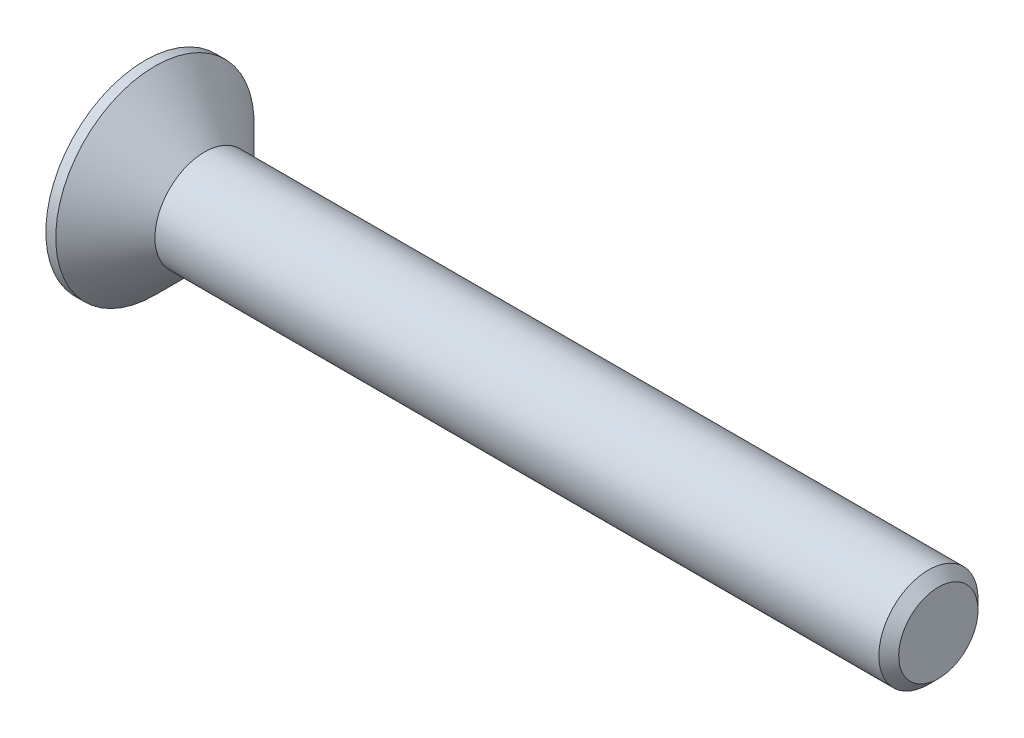
ISO-10303-21;
HEADER;
FILE_DESCRIPTION(('STEP AP214'),'2;1');
FILE_NAME('part.step','',(''),(''),'','','');
FILE_SCHEMA(('AUTOMOTIVE_DESIGN { 1 0 10303 214 1 1 1 1 }'));
ENDSEC;
DATA;
#1=APPLICATION_CONTEXT('core data for automotive mechanical design processes');
#2=APPLICATION_PROTOCOL_DEFINITION('international standard','automotive_design',2000,#1);
#3=PRODUCT_CONTEXT('',#1,'mechanical');
#4=PRODUCT('Part','Part','',(#3));
#5=PRODUCT_RELATED_PRODUCT_CATEGORY('part','',(#4));
#6=PRODUCT_DEFINITION_FORMATION('','',#4);
#7=PRODUCT_DEFINITION_CONTEXT('part definition',#1,'design');
#8=PRODUCT_DEFINITION('design','',#6,#7);
#9=PRODUCT_DEFINITION_SHAPE('','',#8);
#10=(LENGTH_UNIT() NAMED_UNIT(*) SI_UNIT(.MILLI.,.METRE.));
#11=(NAMED_UNIT(*) PLANE_ANGLE_UNIT() SI_UNIT($,.RADIAN.));
#12=(NAMED_UNIT(*) SI_UNIT($,.STERADIAN.) SOLID_ANGLE_UNIT());
#13=UNCERTAINTY_MEASURE_WITH_UNIT(LENGTH_MEASURE(1.E-05),#10,'distance_accuracy_value','');
#14=(GEOMETRIC_REPRESENTATION_CONTEXT(3) GLOBAL_UNCERTAINTY_ASSIGNED_CONTEXT((#13)) GLOBAL_UNIT_ASSIGNED_CONTEXT((#10,
#11,#12)) REPRESENTATION_CONTEXT('',''));
#15=CARTESIAN_POINT('',(0.,0.,0.));
#16=DIRECTION('',(0.,0.,1.));
#17=DIRECTION('',(1.,0.,0.));
#18=AXIS2_PLACEMENT_3D('',#15,#16,#17);
#19=CARTESIAN_POINT('',(-1.2,0.,0.));
#20=DIRECTION('',(-1.,0.,0.));
#21=DIRECTION('',(0.,-1.,0.));
#22=AXIS2_PLACEMENT_3D('',#19,#20,#21);
#23=CYLINDRICAL_SURFACE('',#22,1.);
#24=CARTESIAN_POINT('',(14.6,0.,0.));
#25=DIRECTION('',(-1.,0.,0.));
#26=DIRECTION('',(0.,-1.,0.));
#27=AXIS2_PLACEMENT_3D('',#24,#25,#26);
#28=CIRCLE('',#27,1.);
#29=CARTESIAN_POINT('',(14.6,-1.,0.));
#30=VERTEX_POINT('',#29);
#31=EDGE_CURVE('E43',#30,#30,#28,.T.);
#32=ORIENTED_EDGE('',*,*,#31,.T.);
#33=EDGE_LOOP('',(#32));
#34=FACE_BOUND('',#33,.T.);
#35=CARTESIAN_POINT('',(0.,0.,0.));
#36=DIRECTION('',(-1.,0.,0.));
#37=DIRECTION('',(0.,-1.,0.));
#38=AXIS2_PLACEMENT_3D('',#35,#36,#37);
#39=CIRCLE('',#38,1.);
#40=CARTESIAN_POINT('',(0.,-1.,0.));
#41=VERTEX_POINT('',#40);
#42=EDGE_CURVE('E148',#41,#41,#39,.T.);
#43=ORIENTED_EDGE('',*,*,#42,.F.);
#44=EDGE_LOOP('',(#43));
#45=FACE_BOUND('',#44,.T.);
#46=ADVANCED_FACE('F35',(#34,#45),#23,.T.);
#47=CARTESIAN_POINT('',(0.,0.,0.));
#48=DIRECTION('',(-1.,0.,0.));
#49=DIRECTION('',(0.,-1.,0.));
#50=AXIS2_PLACEMENT_3D('',#47,#48,#49);
#51=CONICAL_SURFACE('',#50,1.,0.785398163397444);
#52=CARTESIAN_POINT('',(-1.00000000000001,0.,0.));
#53=DIRECTION('',(-1.,0.,0.));
#54=DIRECTION('',(0.,-1.,0.));
#55=AXIS2_PLACEMENT_3D('',#52,#53,#54);
#56=CIRCLE('',#55,2.);
#57=CARTESIAN_POINT('',(-1.00000000000001,-2.,0.));
#58=VERTEX_POINT('',#57);
#59=EDGE_CURVE('E145',#58,#58,#56,.T.);
#60=ORIENTED_EDGE('',*,*,#59,.F.);
#61=EDGE_LOOP('',(#60));
#62=FACE_BOUND('',#61,.T.);
#63=ORIENTED_EDGE('',*,*,#42,.T.);
#64=EDGE_LOOP('',(#63));
#65=FACE_BOUND('',#64,.T.);
#66=ADVANCED_FACE('F170',(#62,#65),#51,.T.);
#67=CARTESIAN_POINT('',(-1.2,0.,0.));
#68=DIRECTION('',(-1.,0.,0.));
#69=DIRECTION('',(0.,-1.,0.));
#70=AXIS2_PLACEMENT_3D('',#67,#68,#69);
#71=CYLINDRICAL_SURFACE('',#70,2.);
#72=CARTESIAN_POINT('',(-1.2,0.,0.));
#73=DIRECTION('',(-1.,0.,0.));
#74=DIRECTION('',(0.,-1.,0.));
#75=AXIS2_PLACEMENT_3D('',#72,#73,#74);
#76=CIRCLE('',#75,2.);
#77=CARTESIAN_POINT('',(-1.2,-2.,0.));
#78=VERTEX_POINT('',#77);
#79=EDGE_CURVE('E137',#78,#78,#76,.T.);
#80=ORIENTED_EDGE('',*,*,#79,.F.);
#81=EDGE_LOOP('',(#80));
#82=FACE_BOUND('',#81,.T.);
#83=ORIENTED_EDGE('',*,*,#59,.T.);
#84=EDGE_LOOP('',(#83));
#85=FACE_BOUND('',#84,.T.);
#86=ADVANCED_FACE('F174',(#82,#85),#71,.T.);
#87=CARTESIAN_POINT('',(-1.2,2.,0.));
#88=DIRECTION('',(1.,0.,0.));
#89=DIRECTION('',(0.,1.,0.));
#90=AXIS2_PLACEMENT_3D('',#87,#88,#89);
#91=PLANE('',#90);
#92=DIRECTION('',(0.,-0.866025403784439,0.5));
#93=VECTOR('',#92,1.);
#94=CARTESIAN_POINT('',(-1.2,0.,-0.750555349946514));
#95=LINE('',#94,#93);
#96=CARTESIAN_POINT('',(-1.2,0.,-0.750555349946513));
#97=VERTEX_POINT('',#96);
#98=CARTESIAN_POINT('',(-1.2,-0.65,-0.375277674973257));
#99=VERTEX_POINT('',#98);
#100=EDGE_CURVE('E124',#97,#99,#95,.T.);
#101=ORIENTED_EDGE('',*,*,#100,.F.);
#102=DIRECTION('',(0.,-0.866025403784438,-0.5));
#103=VECTOR('',#102,1.);
#104=CARTESIAN_POINT('',(-1.2,0.65,-0.375277674973257));
#105=LINE('',#104,#103);
#106=CARTESIAN_POINT('',(-1.2,0.65,-0.375277674973257));
#107=VERTEX_POINT('',#106);
#108=EDGE_CURVE('E50',#107,#97,#105,.T.);
#109=ORIENTED_EDGE('',*,*,#108,.F.);
#110=DIRECTION('',(0.,0.,-1.));
#111=VECTOR('',#110,1.);
#112=CARTESIAN_POINT('',(-1.2,0.65,0.375277674973257));
#113=LINE('',#112,#111);
#114=CARTESIAN_POINT('',(-1.2,0.65,0.375277674973257));
#115=VERTEX_POINT('',#114);
#116=EDGE_CURVE('E133',#115,#107,#113,.T.);
#117=ORIENTED_EDGE('',*,*,#116,.F.);
#118=DIRECTION('',(0.,0.866025403784439,-0.5));
#119=VECTOR('',#118,1.);
#120=CARTESIAN_POINT('',(-1.2,0.,0.750555349946513));
#121=LINE('',#120,#119);
#122=CARTESIAN_POINT('',(-1.2,0.,0.750555349946513));
#123=VERTEX_POINT('',#122);
#124=EDGE_CURVE('E131',#123,#115,#121,.T.);
#125=ORIENTED_EDGE('',*,*,#124,.F.);
#126=DIRECTION('',(0.,0.866025403784439,0.5));
#127=VECTOR('',#126,1.);
#128=CARTESIAN_POINT('',(-1.2,-0.65,0.375277674973257));
#129=LINE('',#128,#127);
#130=CARTESIAN_POINT('',(-1.2,-0.65,0.375277674973257));
#131=VERTEX_POINT('',#130);
#132=EDGE_CURVE('E98',#131,#123,#129,.T.);
#133=ORIENTED_EDGE('',*,*,#132,.F.);
#134=DIRECTION('',(0.,0.,1.));
#135=VECTOR('',#134,1.);
#136=CARTESIAN_POINT('',(-1.2,-0.65,-0.375277674973257));
#137=LINE('',#136,#135);
#138=EDGE_CURVE('E127',#99,#131,#137,.T.);
#139=ORIENTED_EDGE('',*,*,#138,.F.);
#140=EDGE_LOOP('',(#101,#109,#117,#125,#133,#139));
#141=FACE_BOUND('',#140,.T.);
#142=ORIENTED_EDGE('',*,*,#79,.T.);
#143=EDGE_LOOP('',(#142));
#144=FACE_BOUND('',#143,.T.);
#145=ADVANCED_FACE('F165',(#141,#144),#91,.F.);
#146=CARTESIAN_POINT('',(14.8,0.,0.));
#147=DIRECTION('',(-1.,0.,0.));
#148=DIRECTION('',(0.,-1.,0.));
#149=AXIS2_PLACEMENT_3D('',#146,#147,#148);
#150=PLANE('',#149);
#151=CARTESIAN_POINT('',(14.8,0.,0.));
#152=DIRECTION('',(-1.,0.,0.));
#153=DIRECTION('',(0.,-1.,0.));
#154=AXIS2_PLACEMENT_3D('',#151,#152,#153);
#155=CIRCLE('',#154,0.8);
#156=CARTESIAN_POINT('',(14.8,-0.8,0.));
#157=VERTEX_POINT('',#156);
#158=EDGE_CURVE('E11',#157,#157,#155,.F.);
#159=ORIENTED_EDGE('',*,*,#158,.T.);
#160=EDGE_LOOP('',(#159));
#161=FACE_BOUND('',#160,.T.);
#162=ADVANCED_FACE('F157',(#161),#150,.F.);
#163=CARTESIAN_POINT('',(14.6,0.,0.));
#164=DIRECTION('',(-1.,0.,0.));
#165=DIRECTION('',(0.,-1.,0.));
#166=AXIS2_PLACEMENT_3D('',#163,#164,#165);
#167=CONICAL_SURFACE('',#166,1.,0.785398163397442);
#168=ORIENTED_EDGE('',*,*,#158,.F.);
#169=EDGE_LOOP('',(#168));
#170=FACE_BOUND('',#169,.T.);
#171=ORIENTED_EDGE('',*,*,#31,.F.);
#172=EDGE_LOOP('',(#171));
#173=FACE_BOUND('',#172,.T.);
#174=ADVANCED_FACE('F37',(#170,#173),#167,.T.);
#175=CARTESIAN_POINT('',(-0.45,0.65,-0.375277674973257));
#176=DIRECTION('',(0.,0.5,-0.866025403784439));
#177=DIRECTION('',(0.,0.866025403784439,0.5));
#178=AXIS2_PLACEMENT_3D('',#175,#176,#177);
#179=PLANE('',#178);
#180=ORIENTED_EDGE('',*,*,#108,.T.);
#181=DIRECTION('',(-1.,0.,0.));
#182=VECTOR('',#181,1.);
#183=CARTESIAN_POINT('',(-0.45,0.,-0.750555349946514));
#184=LINE('',#183,#182);
#185=CARTESIAN_POINT('',(-0.45,0.,-0.750555349946514));
#186=VERTEX_POINT('',#185);
#187=EDGE_CURVE('E80',#186,#97,#184,.T.);
#188=ORIENTED_EDGE('',*,*,#187,.F.);
#189=DIRECTION('',(0.,-0.866025403784438,-0.5));
#190=VECTOR('',#189,1.);
#191=CARTESIAN_POINT('',(-0.45,0.65,-0.375277674973257));
#192=LINE('',#191,#190);
#193=CARTESIAN_POINT('',(-0.45,0.65,-0.375277674973257));
#194=VERTEX_POINT('',#193);
#195=EDGE_CURVE('E135',#194,#186,#192,.T.);
#196=ORIENTED_EDGE('',*,*,#195,.F.);
#197=DIRECTION('',(-1.,0.,0.));
#198=VECTOR('',#197,1.);
#199=CARTESIAN_POINT('',(-0.45,0.65,-0.375277674973257));
#200=LINE('',#199,#198);
#201=EDGE_CURVE('E58',#194,#107,#200,.T.);
#202=ORIENTED_EDGE('',*,*,#201,.T.);
#203=EDGE_LOOP('',(#180,#188,#196,#202));
#204=FACE_BOUND('',#203,.T.);
#205=ADVANCED_FACE('F156',(#204),#179,.F.);
#206=CARTESIAN_POINT('',(-0.45,0.65,0.375277674973257));
#207=DIRECTION('',(0.,1.,0.));
#208=DIRECTION('',(0.,0.,1.));
#209=AXIS2_PLACEMENT_3D('',#206,#207,#208);
#210=PLANE('',#209);
#211=ORIENTED_EDGE('',*,*,#116,.T.);
#212=ORIENTED_EDGE('',*,*,#201,.F.);
#213=DIRECTION('',(0.,0.,-1.));
#214=VECTOR('',#213,1.);
#215=CARTESIAN_POINT('',(-0.45,0.65,0.375277674973257));
#216=LINE('',#215,#214);
#217=CARTESIAN_POINT('',(-0.45,0.65,0.375277674973257));
#218=VERTEX_POINT('',#217);
#219=EDGE_CURVE('E110',#218,#194,#216,.T.);
#220=ORIENTED_EDGE('',*,*,#219,.F.);
#221=DIRECTION('',(-1.,0.,0.));
#222=VECTOR('',#221,1.);
#223=CARTESIAN_POINT('',(-0.45,0.65,0.375277674973257));
#224=LINE('',#223,#222);
#225=EDGE_CURVE('E102',#218,#115,#224,.T.);
#226=ORIENTED_EDGE('',*,*,#225,.T.);
#227=EDGE_LOOP('',(#211,#212,#220,#226));
#228=FACE_BOUND('',#227,.T.);
#229=ADVANCED_FACE('F163',(#228),#210,.F.);
#230=CARTESIAN_POINT('',(-0.45,0.,0.750555349946513));
#231=DIRECTION('',(0.,0.5,0.866025403784439));
#232=DIRECTION('',(0.,-0.866025403784439,0.5));
#233=AXIS2_PLACEMENT_3D('',#230,#231,#232);
#234=PLANE('',#233);
#235=ORIENTED_EDGE('',*,*,#124,.T.);
#236=ORIENTED_EDGE('',*,*,#225,.F.);
#237=DIRECTION('',(0.,0.866025403784439,-0.5));
#238=VECTOR('',#237,1.);
#239=CARTESIAN_POINT('',(-0.45,0.,0.750555349946513));
#240=LINE('',#239,#238);
#241=CARTESIAN_POINT('',(-0.45,0.,0.750555349946513));
#242=VERTEX_POINT('',#241);
#243=EDGE_CURVE('E106',#242,#218,#240,.T.);
#244=ORIENTED_EDGE('',*,*,#243,.F.);
#245=DIRECTION('',(-1.,0.,0.));
#246=VECTOR('',#245,1.);
#247=CARTESIAN_POINT('',(-0.45,0.,0.750555349946513));
#248=LINE('',#247,#246);
#249=EDGE_CURVE('E91',#242,#123,#248,.T.);
#250=ORIENTED_EDGE('',*,*,#249,.T.);
#251=EDGE_LOOP('',(#235,#236,#244,#250));
#252=FACE_BOUND('',#251,.T.);
#253=ADVANCED_FACE('F107',(#252),#234,.F.);
#254=CARTESIAN_POINT('',(-0.45,-0.65,0.375277674973257));
#255=DIRECTION('',(0.,-0.5,0.866025403784439));
#256=DIRECTION('',(0.,-0.866025403784439,-0.5));
#257=AXIS2_PLACEMENT_3D('',#254,#255,#256);
#258=PLANE('',#257);
#259=ORIENTED_EDGE('',*,*,#132,.T.);
#260=ORIENTED_EDGE('',*,*,#249,.F.);
#261=DIRECTION('',(0.,0.866025403784439,0.5));
#262=VECTOR('',#261,1.);
#263=CARTESIAN_POINT('',(-0.45,-0.65,0.375277674973257));
#264=LINE('',#263,#262);
#265=CARTESIAN_POINT('',(-0.45,-0.65,0.375277674973257));
#266=VERTEX_POINT('',#265);
#267=EDGE_CURVE('E95',#266,#242,#264,.T.);
#268=ORIENTED_EDGE('',*,*,#267,.F.);
#269=DIRECTION('',(-1.,0.,0.));
#270=VECTOR('',#269,1.);
#271=CARTESIAN_POINT('',(-0.45,-0.65,0.375277674973257));
#272=LINE('',#271,#270);
#273=EDGE_CURVE('E103',#266,#131,#272,.T.);
#274=ORIENTED_EDGE('',*,*,#273,.T.);
#275=EDGE_LOOP('',(#259,#260,#268,#274));
#276=FACE_BOUND('',#275,.T.);
#277=ADVANCED_FACE('F93',(#276),#258,.F.);
#278=CARTESIAN_POINT('',(-0.45,-0.65,-0.375277674973257));
#279=DIRECTION('',(0.,-1.,0.));
#280=DIRECTION('',(0.,0.,-1.));
#281=AXIS2_PLACEMENT_3D('',#278,#279,#280);
#282=PLANE('',#281);
#283=ORIENTED_EDGE('',*,*,#138,.T.);
#284=ORIENTED_EDGE('',*,*,#273,.F.);
#285=DIRECTION('',(0.,0.,1.));
#286=VECTOR('',#285,1.);
#287=CARTESIAN_POINT('',(-0.45,-0.65,-0.375277674973257));
#288=LINE('',#287,#286);
#289=CARTESIAN_POINT('',(-0.45,-0.65,-0.375277674973257));
#290=VERTEX_POINT('',#289);
#291=EDGE_CURVE('E116',#290,#266,#288,.T.);
#292=ORIENTED_EDGE('',*,*,#291,.F.);
#293=DIRECTION('',(-1.,0.,0.));
#294=VECTOR('',#293,1.);
#295=CARTESIAN_POINT('',(-0.45,-0.65,-0.375277674973257));
#296=LINE('',#295,#294);
#297=EDGE_CURVE('E140',#290,#99,#296,.T.);
#298=ORIENTED_EDGE('',*,*,#297,.T.);
#299=EDGE_LOOP('',(#283,#284,#292,#298));
#300=FACE_BOUND('',#299,.T.);
#301=ADVANCED_FACE('F187',(#300),#282,.F.);
#302=CARTESIAN_POINT('',(-0.45,0.,-0.750555349946514));
#303=DIRECTION('',(0.,-0.5,-0.866025403784439));
#304=DIRECTION('',(0.,0.866025403784439,-0.5));
#305=AXIS2_PLACEMENT_3D('',#302,#303,#304);
#306=PLANE('',#305);
#307=ORIENTED_EDGE('',*,*,#100,.T.);
#308=ORIENTED_EDGE('',*,*,#297,.F.);
#309=DIRECTION('',(0.,-0.866025403784439,0.5));
#310=VECTOR('',#309,1.);
#311=CARTESIAN_POINT('',(-0.45,0.,-0.750555349946514));
#312=LINE('',#311,#310);
#313=EDGE_CURVE('E118',#186,#290,#312,.T.);
#314=ORIENTED_EDGE('',*,*,#313,.F.);
#315=ORIENTED_EDGE('',*,*,#187,.T.);
#316=EDGE_LOOP('',(#307,#308,#314,#315));
#317=FACE_BOUND('',#316,.T.);
#318=ADVANCED_FACE('F184',(#317),#306,.F.);
#319=CARTESIAN_POINT('',(-0.45,0.,0.));
#320=DIRECTION('',(-1.,0.,0.));
#321=DIRECTION('',(0.,0.,1.));
#322=AXIS2_PLACEMENT_3D('',#319,#320,#321);
#323=PLANE('',#322);
#324=ORIENTED_EDGE('',*,*,#195,.T.);
#325=ORIENTED_EDGE('',*,*,#313,.T.);
#326=ORIENTED_EDGE('',*,*,#291,.T.);
#327=ORIENTED_EDGE('',*,*,#267,.T.);
#328=ORIENTED_EDGE('',*,*,#243,.T.);
#329=ORIENTED_EDGE('',*,*,#219,.T.);
#330=EDGE_LOOP('',(#324,#325,#326,#327,#328,#329));
#331=FACE_BOUND('',#330,.T.);
#332=ADVANCED_FACE('F113',(#331),#323,.T.);
#333=CLOSED_SHELL('',(#46,#66,#86,#145,#162,#174,#205,#229,#253,#277,#301,#318,#332));
#334=MANIFOLD_SOLID_BREP('B2',#333);
#335=ADVANCED_BREP_SHAPE_REPRESENTATION('',(#18,#334),#14);
#336=SHAPE_DEFINITION_REPRESENTATION(#9,#335);
ENDSEC;
END-ISO-10303-21;
